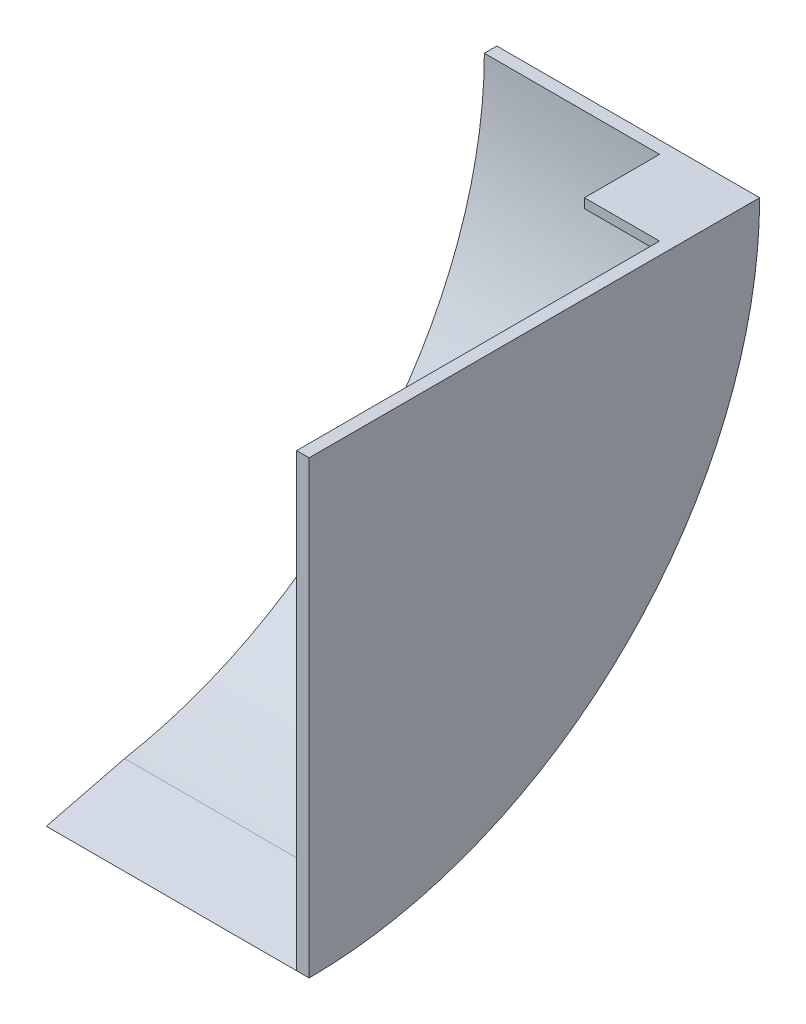
ISO-10303-21;
HEADER;
FILE_DESCRIPTION(('STEP AP214'),'2;1');
FILE_NAME('part.step','',(''),(''),'','','');
FILE_SCHEMA(('AUTOMOTIVE_DESIGN { 1 0 10303 214 1 1 1 1 }'));
ENDSEC;
DATA;
#1=APPLICATION_CONTEXT('core data for automotive mechanical design processes');
#2=APPLICATION_PROTOCOL_DEFINITION('international standard','automotive_design',2000,#1);
#3=PRODUCT_CONTEXT('',#1,'mechanical');
#4=PRODUCT('Part','Part','',(#3));
#5=PRODUCT_RELATED_PRODUCT_CATEGORY('part','',(#4));
#6=PRODUCT_DEFINITION_FORMATION('','',#4);
#7=PRODUCT_DEFINITION_CONTEXT('part definition',#1,'design');
#8=PRODUCT_DEFINITION('design','',#6,#7);
#9=PRODUCT_DEFINITION_SHAPE('','',#8);
#10=(LENGTH_UNIT() NAMED_UNIT(*) SI_UNIT(.MILLI.,.METRE.));
#11=(NAMED_UNIT(*) PLANE_ANGLE_UNIT() SI_UNIT($,.RADIAN.));
#12=(NAMED_UNIT(*) SI_UNIT($,.STERADIAN.) SOLID_ANGLE_UNIT());
#13=UNCERTAINTY_MEASURE_WITH_UNIT(LENGTH_MEASURE(1.E-05),#10,'distance_accuracy_value','');
#14=(GEOMETRIC_REPRESENTATION_CONTEXT(3) GLOBAL_UNCERTAINTY_ASSIGNED_CONTEXT((#13)) GLOBAL_UNIT_ASSIGNED_CONTEXT((#10,
#11,#12)) REPRESENTATION_CONTEXT('',''));
#15=CARTESIAN_POINT('',(0.,0.,0.));
#16=DIRECTION('',(0.,0.,1.));
#17=DIRECTION('',(1.,0.,0.));
#18=AXIS2_PLACEMENT_3D('',#15,#16,#17);
#19=CARTESIAN_POINT('',(100.,0.,0.));
#20=DIRECTION('',(-1.,0.,0.));
#21=DIRECTION('',(0.,0.,1.));
#22=AXIS2_PLACEMENT_3D('',#19,#20,#21);
#23=CYLINDRICAL_SURFACE('',#22,175.);
#24=DIRECTION('',(-1.,0.,0.));
#25=VECTOR('',#24,1.);
#26=CARTESIAN_POINT('',(100.,-3.76232858270708,-174.959552136017));
#27=LINE('',#26,#25);
#28=CARTESIAN_POINT('',(70.,-3.76232858270708,-174.959552136017));
#29=VERTEX_POINT('',#28);
#30=CARTESIAN_POINT('',(100.,-3.76232858270708,-174.959552136017));
#31=VERTEX_POINT('',#30);
#32=EDGE_CURVE('E123',#29,#31,#27,.F.);
#33=ORIENTED_EDGE('',*,*,#32,.F.);
#34=CARTESIAN_POINT('',(70.,0.,0.));
#35=DIRECTION('',(1.,0.,0.));
#36=DIRECTION('',(0.,0.,-1.));
#37=AXIS2_PLACEMENT_3D('',#34,#35,#36);
#38=CIRCLE('',#37,175.);
#39=CARTESIAN_POINT('',(70.,0.,-175.));
#40=VERTEX_POINT('',#39);
#41=EDGE_CURVE('E113',#40,#29,#38,.F.);
#42=ORIENTED_EDGE('',*,*,#41,.F.);
#43=DIRECTION('',(-1.,0.,0.));
#44=VECTOR('',#43,1.);
#45=CARTESIAN_POINT('',(100.,0.,-175.));
#46=LINE('',#45,#44);
#47=CARTESIAN_POINT('',(0.,0.,-175.));
#48=VERTEX_POINT('',#47);
#49=EDGE_CURVE('E152',#40,#48,#46,.T.);
#50=ORIENTED_EDGE('',*,*,#49,.T.);
#51=CARTESIAN_POINT('',(0.,0.,0.));
#52=DIRECTION('',(-1.,0.,0.));
#53=DIRECTION('',(0.,0.,-1.));
#54=AXIS2_PLACEMENT_3D('',#51,#52,#53);
#55=CIRCLE('',#54,175.);
#56=CARTESIAN_POINT('',(0.,-172.18646503884,-31.2541398446407));
#57=VERTEX_POINT('',#56);
#58=EDGE_CURVE('E150',#48,#57,#55,.T.);
#59=ORIENTED_EDGE('',*,*,#58,.T.);
#60=DIRECTION('',(-1.,0.,0.));
#61=VECTOR('',#60,1.);
#62=CARTESIAN_POINT('',(100.,-172.18646503884,-31.2541398446407));
#63=LINE('',#62,#61);
#64=CARTESIAN_POINT('',(100.,-172.18646503884,-31.2541398446407));
#65=VERTEX_POINT('',#64);
#66=EDGE_CURVE('E170',#57,#65,#63,.F.);
#67=ORIENTED_EDGE('',*,*,#66,.T.);
#68=CARTESIAN_POINT('',(100.,0.,0.));
#69=DIRECTION('',(-1.,0.,0.));
#70=DIRECTION('',(0.,0.,-1.));
#71=AXIS2_PLACEMENT_3D('',#68,#69,#70);
#72=CIRCLE('',#71,175.);
#73=EDGE_CURVE('E60',#31,#65,#72,.T.);
#74=ORIENTED_EDGE('',*,*,#73,.F.);
#75=EDGE_LOOP('',(#33,#42,#50,#59,#67,#74));
#76=FACE_BOUND('',#75,.T.);
#77=ADVANCED_FACE('F37',(#76),#23,.F.);
#78=CARTESIAN_POINT('',(100.,0.,0.));
#79=DIRECTION('',(-1.,0.,0.));
#80=DIRECTION('',(0.,0.,1.));
#81=AXIS2_PLACEMENT_3D('',#78,#79,#80);
#82=PLANE('',#81);
#83=DIRECTION('',(0.,1.,0.));
#84=VECTOR('',#83,1.);
#85=CARTESIAN_POINT('',(100.,0.,-145.));
#86=LINE('',#85,#84);
#87=CARTESIAN_POINT('',(100.,-3.76232858270708,-145.));
#88=VERTEX_POINT('',#87);
#89=CARTESIAN_POINT('',(100.,0.,-145.));
#90=VERTEX_POINT('',#89);
#91=EDGE_CURVE('E116',#88,#90,#86,.T.);
#92=ORIENTED_EDGE('',*,*,#91,.F.);
#93=DIRECTION('',(0.,0.,-1.));
#94=VECTOR('',#93,1.);
#95=CARTESIAN_POINT('',(100.,-3.76232858270708,0.));
#96=LINE('',#95,#94);
#97=EDGE_CURVE('E11',#88,#31,#96,.T.);
#98=ORIENTED_EDGE('',*,*,#97,.T.);
#99=ORIENTED_EDGE('',*,*,#73,.T.);
#100=DIRECTION('',(0.,0.242535625036331,-0.970142500145332));
#101=VECTOR('',#100,1.);
#102=CARTESIAN_POINT('',(100.,-180.,0.));
#103=LINE('',#102,#101);
#104=CARTESIAN_POINT('',(100.,-180.,0.));
#105=VERTEX_POINT('',#104);
#106=EDGE_CURVE('E46',#65,#105,#103,.F.);
#107=ORIENTED_EDGE('',*,*,#106,.T.);
#108=DIRECTION('',(0.,-1.,0.));
#109=VECTOR('',#108,1.);
#110=CARTESIAN_POINT('',(100.,0.,0.));
#111=LINE('',#110,#109);
#112=CARTESIAN_POINT('',(100.,0.,0.));
#113=VERTEX_POINT('',#112);
#114=EDGE_CURVE('E139',#113,#105,#111,.T.);
#115=ORIENTED_EDGE('',*,*,#114,.F.);
#116=DIRECTION('',(0.,0.,1.));
#117=VECTOR('',#116,1.);
#118=CARTESIAN_POINT('',(100.,0.,-180.));
#119=LINE('',#118,#117);
#120=EDGE_CURVE('E134',#90,#113,#119,.T.);
#121=ORIENTED_EDGE('',*,*,#120,.F.);
#122=EDGE_LOOP('',(#92,#98,#99,#107,#115,#121));
#123=FACE_BOUND('',#122,.T.);
#124=ADVANCED_FACE('F173',(#123),#82,.T.);
#125=CARTESIAN_POINT('',(100.,-175.,0.));
#126=DIRECTION('',(0.,0.,-1.));
#127=DIRECTION('',(0.,1.,0.));
#128=AXIS2_PLACEMENT_3D('',#125,#126,#127);
#129=PLANE('',#128);
#130=ORIENTED_EDGE('',*,*,#114,.T.);
#131=DIRECTION('',(-1.,0.,0.));
#132=VECTOR('',#131,1.);
#133=CARTESIAN_POINT('',(100.,-180.,0.));
#134=LINE('',#133,#132);
#135=CARTESIAN_POINT('',(105.,-180.,0.));
#136=VERTEX_POINT('',#135);
#137=EDGE_CURVE('E165',#136,#105,#134,.T.);
#138=ORIENTED_EDGE('',*,*,#137,.F.);
#139=DIRECTION('',(0.,-1.,0.));
#140=VECTOR('',#139,1.);
#141=CARTESIAN_POINT('',(105.,0.,0.));
#142=LINE('',#141,#140);
#143=CARTESIAN_POINT('',(105.,0.,0.));
#144=VERTEX_POINT('',#143);
#145=EDGE_CURVE('E138',#144,#136,#142,.T.);
#146=ORIENTED_EDGE('',*,*,#145,.F.);
#147=DIRECTION('',(-1.,0.,0.));
#148=VECTOR('',#147,1.);
#149=CARTESIAN_POINT('',(105.,0.,0.));
#150=LINE('',#149,#148);
#151=EDGE_CURVE('E145',#144,#113,#150,.T.);
#152=ORIENTED_EDGE('',*,*,#151,.T.);
#153=EDGE_LOOP('',(#130,#138,#146,#152));
#154=FACE_BOUND('',#153,.T.);
#155=ADVANCED_FACE('F195',(#154),#129,.F.);
#156=CARTESIAN_POINT('',(100.,0.,0.));
#157=DIRECTION('',(-1.,0.,0.));
#158=DIRECTION('',(0.,0.,1.));
#159=AXIS2_PLACEMENT_3D('',#156,#157,#158);
#160=CYLINDRICAL_SURFACE('',#159,180.);
#161=CARTESIAN_POINT('',(0.,0.,0.));
#162=DIRECTION('',(1.,0.,0.));
#163=DIRECTION('',(0.,0.,-1.));
#164=AXIS2_PLACEMENT_3D('',#161,#162,#163);
#165=CIRCLE('',#164,180.);
#166=CARTESIAN_POINT('',(0.,-180.,0.));
#167=VERTEX_POINT('',#166);
#168=CARTESIAN_POINT('',(0.,0.,-180.));
#169=VERTEX_POINT('',#168);
#170=EDGE_CURVE('E156',#167,#169,#165,.T.);
#171=ORIENTED_EDGE('',*,*,#170,.T.);
#172=DIRECTION('',(-1.,0.,0.));
#173=VECTOR('',#172,1.);
#174=CARTESIAN_POINT('',(100.,0.,-180.));
#175=LINE('',#174,#173);
#176=CARTESIAN_POINT('',(105.,0.,-180.));
#177=VERTEX_POINT('',#176);
#178=EDGE_CURVE('E161',#177,#169,#175,.T.);
#179=ORIENTED_EDGE('',*,*,#178,.F.);
#180=CARTESIAN_POINT('',(105.,0.,0.));
#181=DIRECTION('',(1.,0.,0.));
#182=DIRECTION('',(0.,0.,1.));
#183=AXIS2_PLACEMENT_3D('',#180,#181,#182);
#184=CIRCLE('',#183,180.);
#185=EDGE_CURVE('E142',#136,#177,#184,.T.);
#186=ORIENTED_EDGE('',*,*,#185,.F.);
#187=ORIENTED_EDGE('',*,*,#137,.T.);
#188=EDGE_CURVE('E164',#105,#167,#134,.T.);
#189=ORIENTED_EDGE('',*,*,#188,.T.);
#190=EDGE_LOOP('',(#171,#179,#186,#187,#189));
#191=FACE_BOUND('',#190,.T.);
#192=ADVANCED_FACE('F181',(#191),#160,.T.);
#193=CARTESIAN_POINT('',(100.,0.,-175.));
#194=DIRECTION('',(0.,-1.,0.));
#195=DIRECTION('',(0.,0.,-1.));
#196=AXIS2_PLACEMENT_3D('',#193,#194,#195);
#197=PLANE('',#196);
#198=ORIENTED_EDGE('',*,*,#49,.F.);
#199=DIRECTION('',(0.,0.,-1.));
#200=VECTOR('',#199,1.);
#201=CARTESIAN_POINT('',(70.,0.,-175.));
#202=LINE('',#201,#200);
#203=CARTESIAN_POINT('',(70.,0.,-145.));
#204=VERTEX_POINT('',#203);
#205=EDGE_CURVE('E126',#204,#40,#202,.T.);
#206=ORIENTED_EDGE('',*,*,#205,.F.);
#207=DIRECTION('',(1.,0.,0.));
#208=VECTOR('',#207,1.);
#209=CARTESIAN_POINT('',(70.,0.,-145.));
#210=LINE('',#209,#208);
#211=EDGE_CURVE('E53',#204,#90,#210,.T.);
#212=ORIENTED_EDGE('',*,*,#211,.T.);
#213=ORIENTED_EDGE('',*,*,#120,.T.);
#214=ORIENTED_EDGE('',*,*,#151,.F.);
#215=DIRECTION('',(0.,0.,1.));
#216=VECTOR('',#215,1.);
#217=CARTESIAN_POINT('',(105.,0.,-180.));
#218=LINE('',#217,#216);
#219=EDGE_CURVE('E135',#177,#144,#218,.T.);
#220=ORIENTED_EDGE('',*,*,#219,.F.);
#221=ORIENTED_EDGE('',*,*,#178,.T.);
#222=DIRECTION('',(0.,0.,1.));
#223=VECTOR('',#222,1.);
#224=CARTESIAN_POINT('',(0.,0.,-175.));
#225=LINE('',#224,#223);
#226=EDGE_CURVE('E153',#169,#48,#225,.T.);
#227=ORIENTED_EDGE('',*,*,#226,.T.);
#228=EDGE_LOOP('',(#198,#206,#212,#213,#214,#220,#221,#227));
#229=FACE_BOUND('',#228,.T.);
#230=ADVANCED_FACE('F190',(#229),#197,.F.);
#231=CARTESIAN_POINT('',(0.,0.,0.));
#232=DIRECTION('',(1.,0.,0.));
#233=DIRECTION('',(0.,0.,-1.));
#234=AXIS2_PLACEMENT_3D('',#231,#232,#233);
#235=PLANE('',#234);
#236=ORIENTED_EDGE('',*,*,#170,.F.);
#237=DIRECTION('',(0.,-0.242535625036331,0.970142500145332));
#238=VECTOR('',#237,1.);
#239=CARTESIAN_POINT('',(0.,-180.,0.));
#240=LINE('',#239,#238);
#241=EDGE_CURVE('E168',#167,#57,#240,.F.);
#242=ORIENTED_EDGE('',*,*,#241,.T.);
#243=ORIENTED_EDGE('',*,*,#58,.F.);
#244=ORIENTED_EDGE('',*,*,#226,.F.);
#245=EDGE_LOOP('',(#236,#242,#243,#244));
#246=FACE_BOUND('',#245,.T.);
#247=ADVANCED_FACE('F186',(#246),#235,.F.);
#248=CARTESIAN_POINT('',(105.,0.,0.));
#249=DIRECTION('',(-1.,0.,0.));
#250=DIRECTION('',(0.,0.,1.));
#251=AXIS2_PLACEMENT_3D('',#248,#249,#250);
#252=PLANE('',#251);
#253=ORIENTED_EDGE('',*,*,#219,.T.);
#254=ORIENTED_EDGE('',*,*,#145,.T.);
#255=ORIENTED_EDGE('',*,*,#185,.T.);
#256=EDGE_LOOP('',(#253,#254,#255));
#257=FACE_BOUND('',#256,.T.);
#258=ADVANCED_FACE('F194',(#257),#252,.F.);
#259=CARTESIAN_POINT('',(100.,-180.,0.));
#260=DIRECTION('',(0.,-0.970142500145332,-0.242535625036331));
#261=DIRECTION('',(-1.,0.,0.));
#262=AXIS2_PLACEMENT_3D('',#259,#260,#261);
#263=PLANE('',#262);
#264=ORIENTED_EDGE('',*,*,#106,.F.);
#265=ORIENTED_EDGE('',*,*,#66,.F.);
#266=ORIENTED_EDGE('',*,*,#241,.F.);
#267=ORIENTED_EDGE('',*,*,#188,.F.);
#268=EDGE_LOOP('',(#264,#265,#266,#267));
#269=FACE_BOUND('',#268,.T.);
#270=ADVANCED_FACE('F40',(#269),#263,.F.);
#271=CARTESIAN_POINT('',(70.,0.,0.));
#272=DIRECTION('',(1.,0.,0.));
#273=DIRECTION('',(0.,0.,-1.));
#274=AXIS2_PLACEMENT_3D('',#271,#272,#273);
#275=PLANE('',#274);
#276=ORIENTED_EDGE('',*,*,#205,.T.);
#277=ORIENTED_EDGE('',*,*,#41,.T.);
#278=DIRECTION('',(0.,0.,1.));
#279=VECTOR('',#278,1.);
#280=CARTESIAN_POINT('',(70.,-3.76232858270708,-145.));
#281=LINE('',#280,#279);
#282=CARTESIAN_POINT('',(70.,-3.76232858270708,-145.));
#283=VERTEX_POINT('',#282);
#284=EDGE_CURVE('E107',#29,#283,#281,.T.);
#285=ORIENTED_EDGE('',*,*,#284,.T.);
#286=DIRECTION('',(0.,1.,0.));
#287=VECTOR('',#286,1.);
#288=CARTESIAN_POINT('',(70.,0.,-145.));
#289=LINE('',#288,#287);
#290=EDGE_CURVE('E111',#283,#204,#289,.T.);
#291=ORIENTED_EDGE('',*,*,#290,.T.);
#292=EDGE_LOOP('',(#276,#277,#285,#291));
#293=FACE_BOUND('',#292,.T.);
#294=ADVANCED_FACE('F109',(#293),#275,.F.);
#295=CARTESIAN_POINT('',(70.,-3.76232858270708,-145.));
#296=DIRECTION('',(0.,1.,0.));
#297=DIRECTION('',(0.,0.,1.));
#298=AXIS2_PLACEMENT_3D('',#295,#296,#297);
#299=PLANE('',#298);
#300=ORIENTED_EDGE('',*,*,#284,.F.);
#301=ORIENTED_EDGE('',*,*,#32,.T.);
#302=ORIENTED_EDGE('',*,*,#97,.F.);
#303=DIRECTION('',(1.,0.,0.));
#304=VECTOR('',#303,1.);
#305=CARTESIAN_POINT('',(70.,-3.76232858270708,-145.));
#306=LINE('',#305,#304);
#307=EDGE_CURVE('E119',#283,#88,#306,.T.);
#308=ORIENTED_EDGE('',*,*,#307,.F.);
#309=EDGE_LOOP('',(#300,#301,#302,#308));
#310=FACE_BOUND('',#309,.T.);
#311=ADVANCED_FACE('F120',(#310),#299,.F.);
#312=CARTESIAN_POINT('',(70.,0.,-145.));
#313=DIRECTION('',(0.,0.,-1.));
#314=DIRECTION('',(-1.,0.,0.));
#315=AXIS2_PLACEMENT_3D('',#312,#313,#314);
#316=PLANE('',#315);
#317=ORIENTED_EDGE('',*,*,#91,.T.);
#318=ORIENTED_EDGE('',*,*,#211,.F.);
#319=ORIENTED_EDGE('',*,*,#290,.F.);
#320=ORIENTED_EDGE('',*,*,#307,.T.);
#321=EDGE_LOOP('',(#317,#318,#319,#320));
#322=FACE_BOUND('',#321,.T.);
#323=ADVANCED_FACE('F125',(#322),#316,.F.);
#324=CLOSED_SHELL('',(#77,#124,#155,#192,#230,#247,#258,#270,#294,#311,#323));
#325=MANIFOLD_SOLID_BREP('B2',#324);
#326=ADVANCED_BREP_SHAPE_REPRESENTATION('',(#18,#325),#14);
#327=SHAPE_DEFINITION_REPRESENTATION(#9,#326);
ENDSEC;
END-ISO-10303-21;
